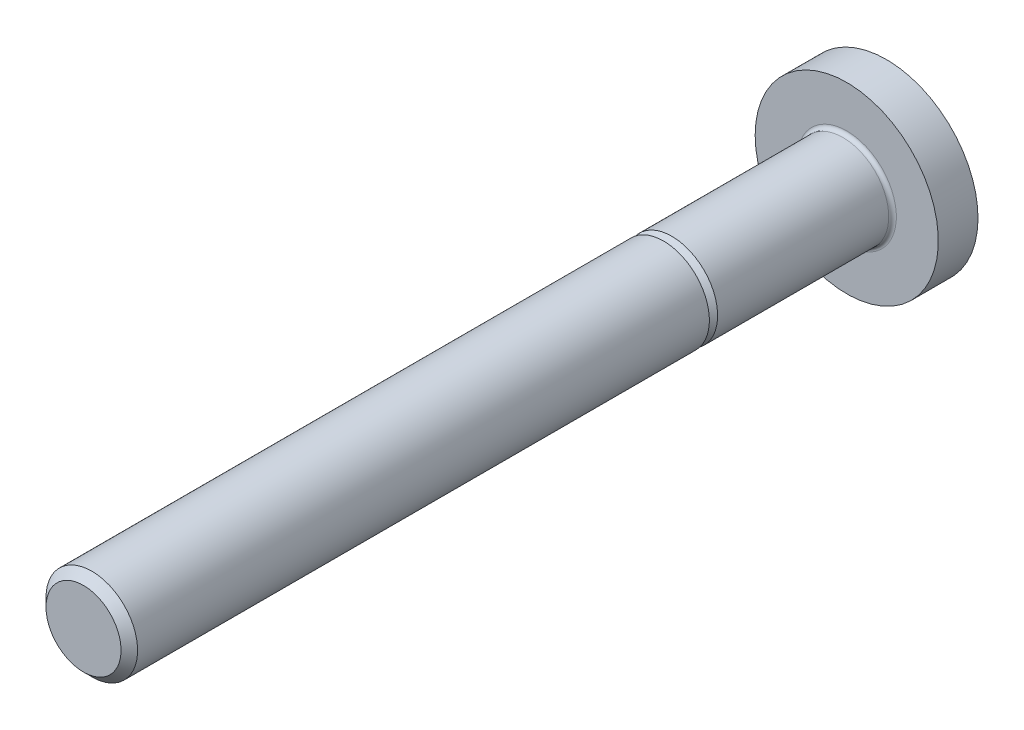
ISO-10303-21;
HEADER;
FILE_DESCRIPTION(('STEP AP214'),'2;1');
FILE_NAME('part.step','',(''),(''),'','','');
FILE_SCHEMA(('AUTOMOTIVE_DESIGN { 1 0 10303 214 1 1 1 1 }'));
ENDSEC;
DATA;
#1=APPLICATION_CONTEXT('core data for automotive mechanical design processes');
#2=APPLICATION_PROTOCOL_DEFINITION('international standard','automotive_design',2000,#1);
#3=PRODUCT_CONTEXT('',#1,'mechanical');
#4=PRODUCT('Part','Part','',(#3));
#5=PRODUCT_RELATED_PRODUCT_CATEGORY('part','',(#4));
#6=PRODUCT_DEFINITION_FORMATION('','',#4);
#7=PRODUCT_DEFINITION_CONTEXT('part definition',#1,'design');
#8=PRODUCT_DEFINITION('design','',#6,#7);
#9=PRODUCT_DEFINITION_SHAPE('','',#8);
#10=(LENGTH_UNIT() NAMED_UNIT(*) SI_UNIT(.MILLI.,.METRE.));
#11=(NAMED_UNIT(*) PLANE_ANGLE_UNIT() SI_UNIT($,.RADIAN.));
#12=(NAMED_UNIT(*) SI_UNIT($,.STERADIAN.) SOLID_ANGLE_UNIT());
#13=UNCERTAINTY_MEASURE_WITH_UNIT(LENGTH_MEASURE(1.E-05),#10,'distance_accuracy_value','');
#14=(GEOMETRIC_REPRESENTATION_CONTEXT(3) GLOBAL_UNCERTAINTY_ASSIGNED_CONTEXT((#13)) GLOBAL_UNIT_ASSIGNED_CONTEXT((#10,
#11,#12)) REPRESENTATION_CONTEXT('',''));
#15=CARTESIAN_POINT('',(0.,0.,0.));
#16=DIRECTION('',(0.,0.,1.));
#17=DIRECTION('',(1.,0.,0.));
#18=AXIS2_PLACEMENT_3D('',#15,#16,#17);
#19=CARTESIAN_POINT('',(0.,0.,10.));
#20=DIRECTION('',(0.,0.,-1.));
#21=DIRECTION('',(0.,1.,0.));
#22=AXIS2_PLACEMENT_3D('',#19,#20,#21);
#23=SPHERICAL_SURFACE('',#22,10.);
#24=CARTESIAN_POINT('',(0.,0.,2.));
#25=DIRECTION('',(0.,0.,-1.));
#26=DIRECTION('',(-1.,0.,0.));
#27=AXIS2_PLACEMENT_3D('',#24,#25,#26);
#28=CIRCLE('',#27,6.);
#29=CARTESIAN_POINT('',(-6.,0.,2.));
#30=VERTEX_POINT('',#29);
#31=EDGE_CURVE('E161',#30,#30,#28,.T.);
#32=ORIENTED_EDGE('',*,*,#31,.T.);
#33=EDGE_LOOP('',(#32));
#34=FACE_BOUND('',#33,.T.);
#35=CARTESIAN_POINT('',(-0.592198364530545,0.276146632527459,9.82491701406006));
#36=DIRECTION('',(-0.875426098065593,0.408217893676735,-0.258819045102521));
#37=DIRECTION('',(-0.422618261740699,-0.90630778703665,0.));
#38=AXIS2_PLACEMENT_3D('',#35,#36,#37);
#39=CIRCLE('',#38,9.97709326820319);
#40=CARTESIAN_POINT('',(1.44664532272572,-1.44664532272572,0.211515203032105));
#41=VERTEX_POINT('',#40);
#42=CARTESIAN_POINT('',(0.477493661765264,-3.2969457071954,0.57120639706331));
#43=VERTEX_POINT('',#42);
#44=EDGE_CURVE('E11',#41,#43,#39,.T.);
#45=ORIENTED_EDGE('',*,*,#44,.F.);
#46=CARTESIAN_POINT('',(-0.276146632527458,0.592198364530546,9.82491701406006));
#47=DIRECTION('',(-0.408217893676735,0.875426098065593,-0.258819045102521));
#48=DIRECTION('',(-0.90630778703665,-0.422618261740699,0.));
#49=AXIS2_PLACEMENT_3D('',#46,#47,#48);
#50=CIRCLE('',#49,9.97709326820319);
#51=CARTESIAN_POINT('',(3.2969457071954,-0.477493661765264,0.571206397063311));
#52=VERTEX_POINT('',#51);
#53=EDGE_CURVE('E25',#52,#41,#50,.T.);
#54=ORIENTED_EDGE('',*,*,#53,.F.);
#55=CARTESIAN_POINT('',(0.718893821528158,0.,10.1926270189222));
#56=DIRECTION('',(-0.965925826289068,0.,-0.258819045102521));
#57=DIRECTION('',(-0.258819045102521,0.,0.965925826289068));
#58=AXIS2_PLACEMENT_3D('',#55,#56,#57);
#59=CIRCLE('',#58,9.97226586613844);
#60=CARTESIAN_POINT('',(3.2969457071954,0.477493661765264,0.571206397063308));
#61=VERTEX_POINT('',#60);
#62=EDGE_CURVE('E225',#61,#52,#59,.T.);
#63=ORIENTED_EDGE('',*,*,#62,.F.);
#64=CARTESIAN_POINT('',(-0.276146632527458,-0.592198364530545,9.82491701406006));
#65=DIRECTION('',(-0.408217893676735,-0.875426098065593,-0.258819045102521));
#66=DIRECTION('',(0.90630778703665,-0.422618261740699,0.));
#67=AXIS2_PLACEMENT_3D('',#64,#65,#66);
#68=CIRCLE('',#67,9.97709326820319);
#69=CARTESIAN_POINT('',(1.44664532272572,1.44664532272572,0.211515203032106));
#70=VERTEX_POINT('',#69);
#71=EDGE_CURVE('E222',#70,#61,#68,.T.);
#72=ORIENTED_EDGE('',*,*,#71,.F.);
#73=CARTESIAN_POINT('',(-0.592198364530544,-0.276146632527458,9.82491701406006));
#74=DIRECTION('',(-0.875426098065593,-0.408217893676735,-0.258819045102521));
#75=DIRECTION('',(0.4226182617407,-0.90630778703665,0.));
#76=AXIS2_PLACEMENT_3D('',#73,#74,#75);
#77=CIRCLE('',#76,9.97709326820319);
#78=CARTESIAN_POINT('',(0.477493661765264,3.2969457071954,0.571206397063311));
#79=VERTEX_POINT('',#78);
#80=EDGE_CURVE('E219',#79,#70,#77,.T.);
#81=ORIENTED_EDGE('',*,*,#80,.F.);
#82=CARTESIAN_POINT('',(0.,0.718893821528157,10.1926270189222));
#83=DIRECTION('',(0.,-0.965925826289068,-0.258819045102521));
#84=DIRECTION('',(0.,0.258819045102521,-0.965925826289068));
#85=AXIS2_PLACEMENT_3D('',#82,#83,#84);
#86=CIRCLE('',#85,9.97226586613844);
#87=CARTESIAN_POINT('',(-0.477493661765264,3.2969457071954,0.57120639706331));
#88=VERTEX_POINT('',#87);
#89=EDGE_CURVE('E216',#88,#79,#86,.T.);
#90=ORIENTED_EDGE('',*,*,#89,.F.);
#91=CARTESIAN_POINT('',(0.592198364530547,-0.276146632527459,9.82491701406006));
#92=DIRECTION('',(0.875426098065593,-0.408217893676735,-0.258819045102521));
#93=DIRECTION('',(0.422618261740699,0.90630778703665,0.));
#94=AXIS2_PLACEMENT_3D('',#91,#92,#93);
#95=CIRCLE('',#94,9.97709326820319);
#96=CARTESIAN_POINT('',(-1.44664532272572,1.44664532272572,0.211515203032105));
#97=VERTEX_POINT('',#96);
#98=EDGE_CURVE('E213',#97,#88,#95,.T.);
#99=ORIENTED_EDGE('',*,*,#98,.F.);
#100=CARTESIAN_POINT('',(0.276146632527459,-0.592198364530546,9.82491701406006));
#101=DIRECTION('',(0.408217893676735,-0.875426098065593,-0.258819045102521));
#102=DIRECTION('',(0.90630778703665,0.422618261740699,0.));
#103=AXIS2_PLACEMENT_3D('',#100,#101,#102);
#104=CIRCLE('',#103,9.97709326820319);
#105=CARTESIAN_POINT('',(-3.2969457071954,0.477493661765265,0.571206397063311));
#106=VERTEX_POINT('',#105);
#107=EDGE_CURVE('E210',#106,#97,#104,.T.);
#108=ORIENTED_EDGE('',*,*,#107,.F.);
#109=CARTESIAN_POINT('',(-0.718893821528157,0.,10.1926270189222));
#110=DIRECTION('',(0.965925826289068,0.,-0.258819045102521));
#111=DIRECTION('',(-0.258819045102521,0.,-0.965925826289068));
#112=AXIS2_PLACEMENT_3D('',#109,#110,#111);
#113=CIRCLE('',#112,9.97226586613844);
#114=CARTESIAN_POINT('',(-3.2969457071954,-0.477493661765263,0.571206397063311));
#115=VERTEX_POINT('',#114);
#116=EDGE_CURVE('E207',#115,#106,#113,.T.);
#117=ORIENTED_EDGE('',*,*,#116,.F.);
#118=CARTESIAN_POINT('',(0.276146632527459,0.592198364530546,9.82491701406006));
#119=DIRECTION('',(0.408217893676735,0.875426098065593,-0.258819045102521));
#120=DIRECTION('',(-0.90630778703665,0.422618261740699,0.));
#121=AXIS2_PLACEMENT_3D('',#118,#119,#120);
#122=CIRCLE('',#121,9.97709326820319);
#123=CARTESIAN_POINT('',(-1.44664532272572,-1.44664532272572,0.211515203032107));
#124=VERTEX_POINT('',#123);
#125=EDGE_CURVE('E204',#124,#115,#122,.T.);
#126=ORIENTED_EDGE('',*,*,#125,.F.);
#127=CARTESIAN_POINT('',(0.592198364530545,0.276146632527458,9.82491701406006));
#128=DIRECTION('',(0.875426098065593,0.408217893676735,-0.258819045102521));
#129=DIRECTION('',(-0.422618261740699,0.90630778703665,0.));
#130=AXIS2_PLACEMENT_3D('',#127,#128,#129);
#131=CIRCLE('',#130,9.97709326820319);
#132=CARTESIAN_POINT('',(-0.477493661765264,-3.2969457071954,0.571206397063311));
#133=VERTEX_POINT('',#132);
#134=EDGE_CURVE('E201',#133,#124,#131,.T.);
#135=ORIENTED_EDGE('',*,*,#134,.F.);
#136=CARTESIAN_POINT('',(0.,-0.718893821528157,10.1926270189222));
#137=DIRECTION('',(0.,0.965925826289068,-0.258819045102521));
#138=DIRECTION('',(0.,0.258819045102521,0.965925826289068));
#139=AXIS2_PLACEMENT_3D('',#136,#137,#138);
#140=CIRCLE('',#139,9.97226586613844);
#141=EDGE_CURVE('E198',#43,#133,#140,.T.);
#142=ORIENTED_EDGE('',*,*,#141,.F.);
#143=EDGE_LOOP('',(#45,#54,#63,#72,#81,#90,#99,#108,#117,#126,#135,#142));
#144=FACE_BOUND('',#143,.T.);
#145=ADVANCED_FACE('F16',(#34,#144),#23,.T.);
#146=CARTESIAN_POINT('',(0.,0.,54.6));
#147=DIRECTION('',(0.,0.,-1.));
#148=DIRECTION('',(-1.,0.,0.));
#149=AXIS2_PLACEMENT_3D('',#146,#147,#148);
#150=PLANE('',#149);
#151=CARTESIAN_POINT('',(0.,0.,54.6));
#152=DIRECTION('',(0.,0.,-1.));
#153=DIRECTION('',(-1.,0.,0.));
#154=AXIS2_PLACEMENT_3D('',#151,#152,#153);
#155=CIRCLE('',#154,2.45875);
#156=CARTESIAN_POINT('',(-2.45875,0.,54.6));
#157=VERTEX_POINT('',#156);
#158=EDGE_CURVE('E194',#157,#157,#155,.T.);
#159=ORIENTED_EDGE('',*,*,#158,.F.);
#160=EDGE_LOOP('',(#159));
#161=FACE_BOUND('',#160,.T.);
#162=ADVANCED_FACE('F18',(#161),#150,.F.);
#163=CARTESIAN_POINT('',(0.,0.,54.6));
#164=DIRECTION('',(0.,0.,-1.));
#165=DIRECTION('',(-1.,0.,0.));
#166=AXIS2_PLACEMENT_3D('',#163,#164,#165);
#167=CONICAL_SURFACE('',#166,2.45875,0.785398163397449);
#168=CARTESIAN_POINT('',(0.,0.,54.05875));
#169=DIRECTION('',(0.,0.,-1.));
#170=DIRECTION('',(-1.,0.,0.));
#171=AXIS2_PLACEMENT_3D('',#168,#169,#170);
#172=CIRCLE('',#171,3.);
#173=CARTESIAN_POINT('',(-3.,0.,54.05875));
#174=VERTEX_POINT('',#173);
#175=EDGE_CURVE('E190',#174,#174,#172,.T.);
#176=ORIENTED_EDGE('',*,*,#175,.F.);
#177=EDGE_LOOP('',(#176));
#178=FACE_BOUND('',#177,.T.);
#179=ORIENTED_EDGE('',*,*,#158,.T.);
#180=EDGE_LOOP('',(#179));
#181=FACE_BOUND('',#180,.T.);
#182=ADVANCED_FACE('F246',(#178,#181),#167,.T.);
#183=CARTESIAN_POINT('',(0.,0.,0.));
#184=DIRECTION('',(0.,0.,-1.));
#185=DIRECTION('',(-1.,0.,0.));
#186=AXIS2_PLACEMENT_3D('',#183,#184,#185);
#187=CYLINDRICAL_SURFACE('',#186,3.);
#188=CARTESIAN_POINT('',(0.,0.,16.6));
#189=DIRECTION('',(0.,0.,-1.));
#190=DIRECTION('',(-1.,0.,0.));
#191=AXIS2_PLACEMENT_3D('',#188,#189,#190);
#192=CIRCLE('',#191,3.);
#193=CARTESIAN_POINT('',(-3.,0.,16.6));
#194=VERTEX_POINT('',#193);
#195=EDGE_CURVE('E186',#194,#194,#192,.T.);
#196=ORIENTED_EDGE('',*,*,#195,.F.);
#197=EDGE_LOOP('',(#196));
#198=FACE_BOUND('',#197,.T.);
#199=ORIENTED_EDGE('',*,*,#175,.T.);
#200=EDGE_LOOP('',(#199));
#201=FACE_BOUND('',#200,.T.);
#202=ADVANCED_FACE('F258',(#198,#201),#187,.T.);
#203=CARTESIAN_POINT('',(0.,3.,16.6));
#204=DIRECTION('',(0.,0.,1.));
#205=DIRECTION('',(1.,0.,0.));
#206=AXIS2_PLACEMENT_3D('',#203,#204,#205);
#207=PLANE('',#206);
#208=CARTESIAN_POINT('',(0.,0.,16.6));
#209=DIRECTION('',(0.,0.,-1.));
#210=DIRECTION('',(-1.,0.,0.));
#211=AXIS2_PLACEMENT_3D('',#208,#209,#210);
#212=CIRCLE('',#211,2.45875);
#213=CARTESIAN_POINT('',(-2.45875,0.,16.6));
#214=VERTEX_POINT('',#213);
#215=EDGE_CURVE('E182',#214,#214,#212,.T.);
#216=ORIENTED_EDGE('',*,*,#215,.F.);
#217=EDGE_LOOP('',(#216));
#218=FACE_BOUND('',#217,.T.);
#219=ORIENTED_EDGE('',*,*,#195,.T.);
#220=EDGE_LOOP('',(#219));
#221=FACE_BOUND('',#220,.T.);
#222=ADVANCED_FACE('F268',(#218,#221),#207,.F.);
#223=CARTESIAN_POINT('',(0.,0.,16.6));
#224=DIRECTION('',(0.,0.,-1.));
#225=DIRECTION('',(-1.,0.,0.));
#226=AXIS2_PLACEMENT_3D('',#223,#224,#225);
#227=CONICAL_SURFACE('',#226,2.45875,0.78539816339745);
#228=CARTESIAN_POINT('',(0.,0.,16.05875));
#229=DIRECTION('',(0.,0.,-1.));
#230=DIRECTION('',(-1.,0.,0.));
#231=AXIS2_PLACEMENT_3D('',#228,#229,#230);
#232=CIRCLE('',#231,3.);
#233=CARTESIAN_POINT('',(-3.,0.,16.05875));
#234=VERTEX_POINT('',#233);
#235=EDGE_CURVE('E178',#234,#234,#232,.T.);
#236=ORIENTED_EDGE('',*,*,#235,.F.);
#237=EDGE_LOOP('',(#236));
#238=FACE_BOUND('',#237,.T.);
#239=ORIENTED_EDGE('',*,*,#215,.T.);
#240=EDGE_LOOP('',(#239));
#241=FACE_BOUND('',#240,.T.);
#242=ADVANCED_FACE('F279',(#238,#241),#227,.T.);
#243=CARTESIAN_POINT('',(0.,0.,0.));
#244=DIRECTION('',(0.,0.,-1.));
#245=DIRECTION('',(-1.,0.,0.));
#246=AXIS2_PLACEMENT_3D('',#243,#244,#245);
#247=CYLINDRICAL_SURFACE('',#246,3.);
#248=CARTESIAN_POINT('',(0.,0.,4.85));
#249=DIRECTION('',(0.,0.,-1.));
#250=DIRECTION('',(-1.,0.,0.));
#251=AXIS2_PLACEMENT_3D('',#248,#249,#250);
#252=CIRCLE('',#251,3.);
#253=CARTESIAN_POINT('',(-3.,0.,4.85));
#254=VERTEX_POINT('',#253);
#255=EDGE_CURVE('E174',#254,#254,#252,.T.);
#256=ORIENTED_EDGE('',*,*,#255,.F.);
#257=EDGE_LOOP('',(#256));
#258=FACE_BOUND('',#257,.T.);
#259=ORIENTED_EDGE('',*,*,#235,.T.);
#260=EDGE_LOOP('',(#259));
#261=FACE_BOUND('',#260,.T.);
#262=ADVANCED_FACE('F290',(#258,#261),#247,.T.);
#263=CARTESIAN_POINT('',(0.,0.,4.85));
#264=DIRECTION('',(0.,0.,-1.));
#265=DIRECTION('',(-1.,0.,0.));
#266=AXIS2_PLACEMENT_3D('',#263,#264,#265);
#267=TOROIDAL_SURFACE('',#266,3.25,0.25);
#268=ORIENTED_EDGE('',*,*,#255,.T.);
#269=EDGE_LOOP('',(#268));
#270=FACE_BOUND('',#269,.T.);
#271=CARTESIAN_POINT('',(0.,0.,4.6));
#272=DIRECTION('',(0.,0.,-1.));
#273=DIRECTION('',(-1.,0.,0.));
#274=AXIS2_PLACEMENT_3D('',#271,#272,#273);
#275=CIRCLE('',#274,3.25);
#276=CARTESIAN_POINT('',(-3.25,0.,4.6));
#277=VERTEX_POINT('',#276);
#278=EDGE_CURVE('E170',#277,#277,#275,.T.);
#279=ORIENTED_EDGE('',*,*,#278,.F.);
#280=EDGE_LOOP('',(#279));
#281=FACE_BOUND('',#280,.T.);
#282=ADVANCED_FACE('F301',(#270,#281),#267,.F.);
#283=CARTESIAN_POINT('',(0.,3.25,4.6));
#284=DIRECTION('',(0.,0.,-1.));
#285=DIRECTION('',(-1.,0.,0.));
#286=AXIS2_PLACEMENT_3D('',#283,#284,#285);
#287=PLANE('',#286);
#288=CARTESIAN_POINT('',(0.,0.,4.6));
#289=DIRECTION('',(0.,0.,-1.));
#290=DIRECTION('',(-1.,0.,0.));
#291=AXIS2_PLACEMENT_3D('',#288,#289,#290);
#292=CIRCLE('',#291,6.);
#293=CARTESIAN_POINT('',(-6.,0.,4.6));
#294=VERTEX_POINT('',#293);
#295=EDGE_CURVE('E165',#294,#294,#292,.T.);
#296=ORIENTED_EDGE('',*,*,#295,.F.);
#297=EDGE_LOOP('',(#296));
#298=FACE_BOUND('',#297,.T.);
#299=ORIENTED_EDGE('',*,*,#278,.T.);
#300=EDGE_LOOP('',(#299));
#301=FACE_BOUND('',#300,.T.);
#302=ADVANCED_FACE('F312',(#298,#301),#287,.F.);
#303=CARTESIAN_POINT('',(0.,0.,0.));
#304=DIRECTION('',(0.,0.,-1.));
#305=DIRECTION('',(-1.,0.,0.));
#306=AXIS2_PLACEMENT_3D('',#303,#304,#305);
#307=CYLINDRICAL_SURFACE('',#306,6.);
#308=ORIENTED_EDGE('',*,*,#31,.F.);
#309=EDGE_LOOP('',(#308));
#310=FACE_BOUND('',#309,.T.);
#311=ORIENTED_EDGE('',*,*,#295,.T.);
#312=EDGE_LOOP('',(#311));
#313=FACE_BOUND('',#312,.T.);
#314=ADVANCED_FACE('F323',(#310,#313),#307,.T.);
#315=CARTESIAN_POINT('',(0.575,-3.45,0.));
#316=DIRECTION('',(-0.875426098065593,0.408217893676735,-0.258819045102521));
#317=DIRECTION('',(-0.422618261740699,-0.90630778703665,0.));
#318=AXIS2_PLACEMENT_3D('',#315,#316,#317);
#319=PLANE('',#318);
#320=ORIENTED_EDGE('',*,*,#44,.T.);
#321=DIRECTION('',(0.162689201767992,-0.255370893567974,-0.953057149569945));
#322=VECTOR('',#321,1.);
#323=CARTESIAN_POINT('',(0.575,-3.45,0.));
#324=LINE('',#323,#322);
#325=CARTESIAN_POINT('',(0.0458223680937174,-2.61935750346352,3.1));
#326=VERTEX_POINT('',#325);
#327=EDGE_CURVE('E32',#326,#43,#324,.T.);
#328=ORIENTED_EDGE('',*,*,#327,.F.);
#329=DIRECTION('',(0.422618261740699,0.90630778703665,0.));
#330=VECTOR('',#329,1.);
#331=CARTESIAN_POINT('',(0.204481188623116,-2.27911256483834,3.1));
#332=LINE('',#331,#330);
#333=CARTESIAN_POINT('',(0.864244842722194,-0.864244842722194,3.1));
#334=VERTEX_POINT('',#333);
#335=EDGE_CURVE('E118',#326,#334,#332,.T.);
#336=ORIENTED_EDGE('',*,*,#335,.T.);
#337=DIRECTION('',(0.193899607686987,-0.193899607686987,-0.961668281829896));
#338=VECTOR('',#337,1.);
#339=CARTESIAN_POINT('',(1.52863489187,-1.52863489187,-0.195121865642282));
#340=LINE('',#339,#338);
#341=EDGE_CURVE('E166',#334,#41,#340,.T.);
#342=ORIENTED_EDGE('',*,*,#341,.T.);
#343=EDGE_LOOP('',(#320,#328,#336,#342));
#344=FACE_BOUND('',#343,.T.);
#345=ADVANCED_FACE('F117',(#344),#319,.T.);
#346=CARTESIAN_POINT('',(1.48929278824233,-1.48929278824233,0.));
#347=DIRECTION('',(-0.408217893676735,0.875426098065593,-0.258819045102521));
#348=DIRECTION('',(-0.90630778703665,-0.422618261740699,0.));
#349=AXIS2_PLACEMENT_3D('',#346,#347,#348);
#350=PLANE('',#349);
#351=ORIENTED_EDGE('',*,*,#53,.T.);
#352=ORIENTED_EDGE('',*,*,#341,.F.);
#353=DIRECTION('',(0.90630778703665,0.422618261740699,0.));
#354=VECTOR('',#353,1.);
#355=CARTESIAN_POINT('',(0.264295216761573,-1.14400594781486,3.1));
#356=LINE('',#355,#354);
#357=CARTESIAN_POINT('',(2.61935750346352,-0.045822368093717,3.1));
#358=VERTEX_POINT('',#357);
#359=EDGE_CURVE('E125',#334,#358,#356,.T.);
#360=ORIENTED_EDGE('',*,*,#359,.T.);
#361=DIRECTION('',(0.255370893567974,-0.162689201767992,-0.953057149569945));
#362=VECTOR('',#361,1.);
#363=CARTESIAN_POINT('',(3.45,-0.575,0.));
#364=LINE('',#363,#362);
#365=EDGE_CURVE('E568',#358,#52,#364,.T.);
#366=ORIENTED_EDGE('',*,*,#365,.T.);
#367=EDGE_LOOP('',(#351,#352,#360,#366));
#368=FACE_BOUND('',#367,.T.);
#369=ADVANCED_FACE('F343',(#368),#350,.T.);
#370=CARTESIAN_POINT('',(3.45,-0.575,0.));
#371=DIRECTION('',(-0.965925826289068,0.,-0.258819045102521));
#372=DIRECTION('',(-0.258819045102521,0.,0.965925826289068));
#373=AXIS2_PLACEMENT_3D('',#370,#371,#372);
#374=PLANE('',#373);
#375=ORIENTED_EDGE('',*,*,#62,.T.);
#376=ORIENTED_EDGE('',*,*,#365,.F.);
#377=DIRECTION('',(0.,1.,0.));
#378=VECTOR('',#377,1.);
#379=CARTESIAN_POINT('',(2.61935750346352,-2.63015725285255,3.1));
#380=LINE('',#379,#378);
#381=CARTESIAN_POINT('',(2.61935750346352,0.0458223680937175,3.1));
#382=VERTEX_POINT('',#381);
#383=EDGE_CURVE('E132',#358,#382,#380,.T.);
#384=ORIENTED_EDGE('',*,*,#383,.T.);
#385=DIRECTION('',(0.255370893567974,0.162689201767992,-0.953057149569945));
#386=VECTOR('',#385,1.);
#387=CARTESIAN_POINT('',(3.45,0.575,0.));
#388=LINE('',#387,#386);
#389=EDGE_CURVE('E565',#382,#61,#388,.T.);
#390=ORIENTED_EDGE('',*,*,#389,.T.);
#391=EDGE_LOOP('',(#375,#376,#384,#390));
#392=FACE_BOUND('',#391,.T.);
#393=ADVANCED_FACE('F360',(#392),#374,.T.);
#394=CARTESIAN_POINT('',(3.45,0.575,0.));
#395=DIRECTION('',(-0.408217893676735,-0.875426098065593,-0.258819045102521));
#396=DIRECTION('',(0.90630778703665,-0.422618261740699,0.));
#397=AXIS2_PLACEMENT_3D('',#394,#395,#396);
#398=PLANE('',#397);
#399=ORIENTED_EDGE('',*,*,#71,.T.);
#400=ORIENTED_EDGE('',*,*,#389,.F.);
#401=DIRECTION('',(-0.90630778703665,0.422618261740699,0.));
#402=VECTOR('',#401,1.);
#403=CARTESIAN_POINT('',(2.27911256483834,0.204481188623115,3.1));
#404=LINE('',#403,#402);
#405=CARTESIAN_POINT('',(0.864244842722195,0.864244842722194,3.1));
#406=VERTEX_POINT('',#405);
#407=EDGE_CURVE('E138',#382,#406,#404,.T.);
#408=ORIENTED_EDGE('',*,*,#407,.T.);
#409=DIRECTION('',(0.193899607686987,0.193899607686987,-0.961668281829896));
#410=VECTOR('',#409,1.);
#411=CARTESIAN_POINT('',(1.52863489187,1.52863489187,-0.195121865642281));
#412=LINE('',#411,#410);
#413=EDGE_CURVE('E562',#406,#70,#412,.T.);
#414=ORIENTED_EDGE('',*,*,#413,.T.);
#415=EDGE_LOOP('',(#399,#400,#408,#414));
#416=FACE_BOUND('',#415,.T.);
#417=ADVANCED_FACE('F370',(#416),#398,.T.);
#418=CARTESIAN_POINT('',(1.48929278824234,1.48929278824233,0.));
#419=DIRECTION('',(-0.875426098065593,-0.408217893676735,-0.258819045102521));
#420=DIRECTION('',(0.4226182617407,-0.90630778703665,0.));
#421=AXIS2_PLACEMENT_3D('',#418,#419,#420);
#422=PLANE('',#421);
#423=ORIENTED_EDGE('',*,*,#80,.T.);
#424=ORIENTED_EDGE('',*,*,#413,.F.);
#425=DIRECTION('',(-0.4226182617407,0.90630778703665,0.));
#426=VECTOR('',#425,1.);
#427=CARTESIAN_POINT('',(2.21929853669988,-2.041677181675,3.1));
#428=LINE('',#427,#426);
#429=CARTESIAN_POINT('',(0.045822368093718,2.61935750346352,3.1));
#430=VERTEX_POINT('',#429);
#431=EDGE_CURVE('E141',#406,#430,#428,.T.);
#432=ORIENTED_EDGE('',*,*,#431,.T.);
#433=DIRECTION('',(0.162689201767992,0.255370893567974,-0.953057149569945));
#434=VECTOR('',#433,1.);
#435=CARTESIAN_POINT('',(0.575,3.45,0.));
#436=LINE('',#435,#434);
#437=EDGE_CURVE('E559',#430,#79,#436,.T.);
#438=ORIENTED_EDGE('',*,*,#437,.T.);
#439=EDGE_LOOP('',(#423,#424,#432,#438));
#440=FACE_BOUND('',#439,.T.);
#441=ADVANCED_FACE('F382',(#440),#422,.T.);
#442=CARTESIAN_POINT('',(0.575,3.45,0.));
#443=DIRECTION('',(0.,-0.965925826289068,-0.258819045102521));
#444=DIRECTION('',(0.,0.258819045102521,-0.965925826289068));
#445=AXIS2_PLACEMENT_3D('',#442,#443,#444);
#446=PLANE('',#445);
#447=ORIENTED_EDGE('',*,*,#89,.T.);
#448=ORIENTED_EDGE('',*,*,#437,.F.);
#449=DIRECTION('',(-1.,0.,0.));
#450=VECTOR('',#449,1.);
#451=CARTESIAN_POINT('',(0.957298951477691,2.61935750346352,3.1));
#452=LINE('',#451,#450);
#453=CARTESIAN_POINT('',(-0.0458223680937166,2.61935750346352,3.1));
#454=VERTEX_POINT('',#453);
#455=EDGE_CURVE('E144',#430,#454,#452,.T.);
#456=ORIENTED_EDGE('',*,*,#455,.T.);
#457=DIRECTION('',(-0.162689201767992,0.255370893567974,-0.953057149569945));
#458=VECTOR('',#457,1.);
#459=CARTESIAN_POINT('',(-0.575,3.45,0.));
#460=LINE('',#459,#458);
#461=EDGE_CURVE('E556',#454,#88,#460,.T.);
#462=ORIENTED_EDGE('',*,*,#461,.T.);
#463=EDGE_LOOP('',(#447,#448,#456,#462));
#464=FACE_BOUND('',#463,.T.);
#465=ADVANCED_FACE('F394',(#464),#446,.T.);
#466=CARTESIAN_POINT('',(-0.575,3.45,0.));
#467=DIRECTION('',(0.875426098065593,-0.408217893676735,-0.258819045102521));
#468=DIRECTION('',(0.422618261740699,0.90630778703665,0.));
#469=AXIS2_PLACEMENT_3D('',#466,#467,#468);
#470=PLANE('',#469);
#471=ORIENTED_EDGE('',*,*,#98,.T.);
#472=ORIENTED_EDGE('',*,*,#461,.F.);
#473=DIRECTION('',(-0.422618261740699,-0.90630778703665,0.));
#474=VECTOR('',#473,1.);
#475=CARTESIAN_POINT('',(-1.87733948999796,-1.3083436394919,3.1));
#476=LINE('',#475,#474);
#477=CARTESIAN_POINT('',(-0.864244842722192,0.864244842722194,3.1));
#478=VERTEX_POINT('',#477);
#479=EDGE_CURVE('E147',#454,#478,#476,.T.);
#480=ORIENTED_EDGE('',*,*,#479,.T.);
#481=DIRECTION('',(-0.193899607686987,0.193899607686987,-0.961668281829896));
#482=VECTOR('',#481,1.);
#483=CARTESIAN_POINT('',(-1.52863489187,1.52863489187,-0.195121865642282));
#484=LINE('',#483,#482);
#485=EDGE_CURVE('E553',#478,#97,#484,.T.);
#486=ORIENTED_EDGE('',*,*,#485,.T.);
#487=EDGE_LOOP('',(#471,#472,#480,#486));
#488=FACE_BOUND('',#487,.T.);
#489=ADVANCED_FACE('F406',(#488),#470,.T.);
#490=CARTESIAN_POINT('',(-1.48929278824233,1.48929278824233,0.));
#491=DIRECTION('',(0.408217893676735,-0.875426098065593,-0.258819045102521));
#492=DIRECTION('',(0.90630778703665,0.422618261740699,0.));
#493=AXIS2_PLACEMENT_3D('',#490,#491,#492);
#494=PLANE('',#493);
#495=ORIENTED_EDGE('',*,*,#107,.T.);
#496=ORIENTED_EDGE('',*,*,#485,.F.);
#497=DIRECTION('',(-0.90630778703665,-0.422618261740699,0.));
#498=VECTOR('',#497,1.);
#499=CARTESIAN_POINT('',(-0.706473708584873,0.937814730806226,3.1));
#500=LINE('',#499,#498);
#501=CARTESIAN_POINT('',(-2.61935750346352,0.0458223680937181,3.1));
#502=VERTEX_POINT('',#501);
#503=EDGE_CURVE('E150',#478,#502,#500,.T.);
#504=ORIENTED_EDGE('',*,*,#503,.T.);
#505=DIRECTION('',(-0.255370893567974,0.162689201767992,-0.953057149569945));
#506=VECTOR('',#505,1.);
#507=CARTESIAN_POINT('',(-3.45,0.575,0.));
#508=LINE('',#507,#506);
#509=EDGE_CURVE('E550',#502,#106,#508,.T.);
#510=ORIENTED_EDGE('',*,*,#509,.T.);
#511=EDGE_LOOP('',(#495,#496,#504,#510));
#512=FACE_BOUND('',#511,.T.);
#513=ADVANCED_FACE('F418',(#512),#494,.T.);
#514=CARTESIAN_POINT('',(-3.45,0.575,0.));
#515=DIRECTION('',(0.965925826289068,0.,-0.258819045102521));
#516=DIRECTION('',(-0.258819045102521,0.,-0.965925826289068));
#517=AXIS2_PLACEMENT_3D('',#514,#515,#516);
#518=PLANE('',#517);
#519=ORIENTED_EDGE('',*,*,#116,.T.);
#520=ORIENTED_EDGE('',*,*,#509,.F.);
#521=DIRECTION('',(0.,-1.,0.));
#522=VECTOR('',#521,1.);
#523=CARTESIAN_POINT('',(-2.61935750346352,-2.63015725285255,3.1));
#524=LINE('',#523,#522);
#525=CARTESIAN_POINT('',(-2.61935750346352,-0.0458223680937164,3.1));
#526=VERTEX_POINT('',#525);
#527=EDGE_CURVE('E153',#502,#526,#524,.T.);
#528=ORIENTED_EDGE('',*,*,#527,.T.);
#529=DIRECTION('',(-0.255370893567974,-0.162689201767992,-0.953057149569945));
#530=VECTOR('',#529,1.);
#531=CARTESIAN_POINT('',(-3.45,-0.575,0.));
#532=LINE('',#531,#530);
#533=EDGE_CURVE('E545',#526,#115,#532,.T.);
#534=ORIENTED_EDGE('',*,*,#533,.T.);
#535=EDGE_LOOP('',(#519,#520,#528,#534));
#536=FACE_BOUND('',#535,.T.);
#537=ADVANCED_FACE('F430',(#536),#518,.T.);
#538=CARTESIAN_POINT('',(-3.45,-0.575,0.));
#539=DIRECTION('',(0.408217893676735,0.875426098065593,-0.258819045102521));
#540=DIRECTION('',(-0.90630778703665,0.422618261740699,0.));
#541=AXIS2_PLACEMENT_3D('',#538,#539,#540);
#542=PLANE('',#541);
#543=ORIENTED_EDGE('',*,*,#125,.T.);
#544=ORIENTED_EDGE('',*,*,#533,.F.);
#545=DIRECTION('',(0.90630778703665,-0.422618261740699,0.));
#546=VECTOR('',#545,1.);
#547=CARTESIAN_POINT('',(1.30834363949189,-1.87733948999796,3.1));
#548=LINE('',#547,#546);
#549=CARTESIAN_POINT('',(-0.864244842722195,-0.864244842722192,3.1));
#550=VERTEX_POINT('',#549);
#551=EDGE_CURVE('E156',#526,#550,#548,.T.);
#552=ORIENTED_EDGE('',*,*,#551,.T.);
#553=DIRECTION('',(-0.193899607686987,-0.193899607686987,-0.961668281829896));
#554=VECTOR('',#553,1.);
#555=CARTESIAN_POINT('',(-1.52863489187,-1.52863489187,-0.195121865642282));
#556=LINE('',#555,#554);
#557=EDGE_CURVE('E542',#550,#124,#556,.T.);
#558=ORIENTED_EDGE('',*,*,#557,.T.);
#559=EDGE_LOOP('',(#543,#544,#552,#558));
#560=FACE_BOUND('',#559,.T.);
#561=ADVANCED_FACE('F442',(#560),#542,.T.);
#562=CARTESIAN_POINT('',(-1.48929278824234,-1.48929278824233,0.));
#563=DIRECTION('',(0.875426098065593,0.408217893676735,-0.258819045102521));
#564=DIRECTION('',(-0.422618261740699,0.90630778703665,0.));
#565=AXIS2_PLACEMENT_3D('',#562,#563,#564);
#566=PLANE('',#565);
#567=ORIENTED_EDGE('',*,*,#134,.T.);
#568=ORIENTED_EDGE('',*,*,#557,.F.);
#569=DIRECTION('',(0.422618261740699,-0.90630778703665,0.));
#570=VECTOR('',#569,1.);
#571=CARTESIAN_POINT('',(0.1374778580788,-3.01244610702145,3.1));
#572=LINE('',#571,#570);
#573=CARTESIAN_POINT('',(-0.0458223680937176,-2.61935750346352,3.1));
#574=VERTEX_POINT('',#573);
#575=EDGE_CURVE('E113',#550,#574,#572,.T.);
#576=ORIENTED_EDGE('',*,*,#575,.T.);
#577=DIRECTION('',(-0.162689201767992,-0.255370893567974,-0.953057149569945));
#578=VECTOR('',#577,1.);
#579=CARTESIAN_POINT('',(-0.575,-3.45,0.));
#580=LINE('',#579,#578);
#581=EDGE_CURVE('E108',#574,#133,#580,.T.);
#582=ORIENTED_EDGE('',*,*,#581,.T.);
#583=EDGE_LOOP('',(#567,#568,#576,#582));
#584=FACE_BOUND('',#583,.T.);
#585=ADVANCED_FACE('F454',(#584),#566,.T.);
#586=CARTESIAN_POINT('',(-0.575,-3.45,0.));
#587=DIRECTION('',(0.,0.965925826289068,-0.258819045102521));
#588=DIRECTION('',(0.,0.258819045102521,0.965925826289068));
#589=AXIS2_PLACEMENT_3D('',#586,#587,#588);
#590=PLANE('',#589);
#591=ORIENTED_EDGE('',*,*,#141,.T.);
#592=ORIENTED_EDGE('',*,*,#581,.F.);
#593=DIRECTION('',(1.,0.,0.));
#594=VECTOR('',#593,1.);
#595=CARTESIAN_POINT('',(0.957298951477691,-2.61935750346352,3.1));
#596=LINE('',#595,#594);
#597=EDGE_CURVE('E105',#574,#326,#596,.T.);
#598=ORIENTED_EDGE('',*,*,#597,.T.);
#599=ORIENTED_EDGE('',*,*,#327,.T.);
#600=EDGE_LOOP('',(#591,#592,#598,#599));
#601=FACE_BOUND('',#600,.T.);
#602=ADVANCED_FACE('F106',(#601),#590,.T.);
#603=CARTESIAN_POINT('',(0.957298951477691,-2.63015725285255,3.1));
#604=DIRECTION('',(0.,0.,-1.));
#605=DIRECTION('',(-1.,0.,0.));
#606=AXIS2_PLACEMENT_3D('',#603,#604,#605);
#607=PLANE('',#606);
#608=ORIENTED_EDGE('',*,*,#335,.F.);
#609=ORIENTED_EDGE('',*,*,#597,.F.);
#610=ORIENTED_EDGE('',*,*,#575,.F.);
#611=ORIENTED_EDGE('',*,*,#551,.F.);
#612=ORIENTED_EDGE('',*,*,#527,.F.);
#613=ORIENTED_EDGE('',*,*,#503,.F.);
#614=ORIENTED_EDGE('',*,*,#479,.F.);
#615=ORIENTED_EDGE('',*,*,#455,.F.);
#616=ORIENTED_EDGE('',*,*,#431,.F.);
#617=ORIENTED_EDGE('',*,*,#407,.F.);
#618=ORIENTED_EDGE('',*,*,#383,.F.);
#619=ORIENTED_EDGE('',*,*,#359,.F.);
#620=EDGE_LOOP('',(#608,#609,#610,#611,#612,#613,#614,#615,#616,#617,#618,#619));
#621=FACE_BOUND('',#620,.T.);
#622=ADVANCED_FACE('F123',(#621),#607,.T.);
#623=CLOSED_SHELL('',(#145,#162,#182,#202,#222,#242,#262,#282,#302,#314,#345,#369,#393,#417,
#441,#465,#489,#513,#537,#561,#585,#602,#622));
#624=MANIFOLD_SOLID_BREP('B1',#623);
#625=ADVANCED_BREP_SHAPE_REPRESENTATION('',(#18,#624),#14);
#626=SHAPE_DEFINITION_REPRESENTATION(#9,#625);
ENDSEC;
END-ISO-10303-21;
